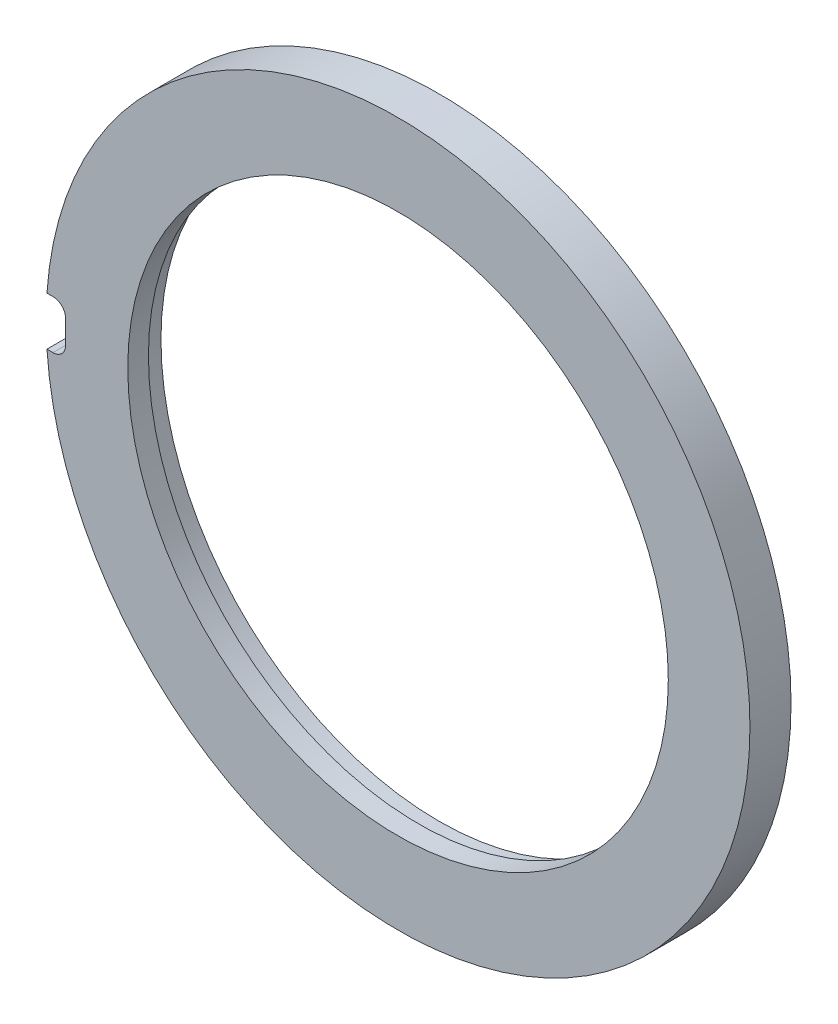
ISO-10303-21;
HEADER;
FILE_DESCRIPTION(('STEP AP214'),'2;1');
FILE_NAME('part.step','',(''),(''),'','','');
FILE_SCHEMA(('AUTOMOTIVE_DESIGN { 1 0 10303 214 1 1 1 1 }'));
ENDSEC;
DATA;
#1=APPLICATION_CONTEXT('core data for automotive mechanical design processes');
#2=APPLICATION_PROTOCOL_DEFINITION('international standard','automotive_design',2000,#1);
#3=PRODUCT_CONTEXT('',#1,'mechanical');
#4=PRODUCT('Part','Part','',(#3));
#5=PRODUCT_RELATED_PRODUCT_CATEGORY('part','',(#4));
#6=PRODUCT_DEFINITION_FORMATION('','',#4);
#7=PRODUCT_DEFINITION_CONTEXT('part definition',#1,'design');
#8=PRODUCT_DEFINITION('design','',#6,#7);
#9=PRODUCT_DEFINITION_SHAPE('','',#8);
#10=(LENGTH_UNIT() NAMED_UNIT(*) SI_UNIT(.MILLI.,.METRE.));
#11=(NAMED_UNIT(*) PLANE_ANGLE_UNIT() SI_UNIT($,.RADIAN.));
#12=(NAMED_UNIT(*) SI_UNIT($,.STERADIAN.) SOLID_ANGLE_UNIT());
#13=UNCERTAINTY_MEASURE_WITH_UNIT(LENGTH_MEASURE(1.E-05),#10,'distance_accuracy_value','');
#14=(GEOMETRIC_REPRESENTATION_CONTEXT(3) GLOBAL_UNCERTAINTY_ASSIGNED_CONTEXT((#13)) GLOBAL_UNIT_ASSIGNED_CONTEXT((#10,
#11,#12)) REPRESENTATION_CONTEXT('',''));
#15=CARTESIAN_POINT('',(0.,0.,0.));
#16=DIRECTION('',(0.,0.,1.));
#17=DIRECTION('',(1.,0.,0.));
#18=AXIS2_PLACEMENT_3D('',#15,#16,#17);
#19=CARTESIAN_POINT('',(0.,0.,0.));
#20=DIRECTION('',(0.,0.,1.));
#21=DIRECTION('',(1.,0.,0.));
#22=AXIS2_PLACEMENT_3D('',#19,#20,#21);
#23=CYLINDRICAL_SURFACE('',#22,16.7);
#24=CARTESIAN_POINT('',(0.,0.,0.));
#25=DIRECTION('',(0.,0.,1.));
#26=DIRECTION('',(1.,0.,0.));
#27=AXIS2_PLACEMENT_3D('',#24,#25,#26);
#28=CIRCLE('',#27,16.7);
#29=CARTESIAN_POINT('',(-16.6603571390292,-1.14999999999994,0.));
#30=VERTEX_POINT('',#29);
#31=CARTESIAN_POINT('',(-16.6603571390292,1.15000000000006,0.));
#32=VERTEX_POINT('',#31);
#33=EDGE_CURVE('E183',#30,#32,#28,.T.);
#34=ORIENTED_EDGE('',*,*,#33,.F.);
#35=DIRECTION('',(0.,0.,-1.));
#36=VECTOR('',#35,1.);
#37=CARTESIAN_POINT('',(-16.6603571390292,-1.14999999999994,1.05));
#38=LINE('',#37,#36);
#39=CARTESIAN_POINT('',(-16.6603571390292,-1.14999999999994,-1.95));
#40=VERTEX_POINT('',#39);
#41=EDGE_CURVE('E117',#30,#40,#38,.T.);
#42=ORIENTED_EDGE('',*,*,#41,.T.);
#43=CARTESIAN_POINT('',(0.,0.,-1.95));
#44=DIRECTION('',(0.,0.,1.));
#45=DIRECTION('',(1.,0.,0.));
#46=AXIS2_PLACEMENT_3D('',#43,#44,#45);
#47=CIRCLE('',#46,16.7);
#48=CARTESIAN_POINT('',(-16.6603571390292,1.15000000000006,-1.95));
#49=VERTEX_POINT('',#48);
#50=EDGE_CURVE('E125',#40,#49,#47,.T.);
#51=ORIENTED_EDGE('',*,*,#50,.T.);
#52=DIRECTION('',(0.,0.,-1.));
#53=VECTOR('',#52,1.);
#54=CARTESIAN_POINT('',(-16.6603571390292,1.15000000000006,1.05));
#55=LINE('',#54,#53);
#56=EDGE_CURVE('E108',#32,#49,#55,.T.);
#57=ORIENTED_EDGE('',*,*,#56,.F.);
#58=EDGE_LOOP('',(#34,#42,#51,#57));
#59=FACE_BOUND('',#58,.T.);
#60=ADVANCED_FACE('F56',(#59),#23,.T.);
#61=CARTESIAN_POINT('',(-16.7,0.,-1.95));
#62=DIRECTION('',(0.,0.,1.));
#63=DIRECTION('',(1.,0.,0.));
#64=AXIS2_PLACEMENT_3D('',#61,#62,#63);
#65=PLANE('',#64);
#66=ORIENTED_EDGE('',*,*,#50,.F.);
#67=DIRECTION('',(-1.,0.,0.));
#68=VECTOR('',#67,1.);
#69=CARTESIAN_POINT('',(-16.6603571390292,-1.14999999999994,-1.95));
#70=LINE('',#69,#68);
#71=CARTESIAN_POINT('',(-16.3736228252639,-1.14999999999994,-1.95));
#72=VERTEX_POINT('',#71);
#73=EDGE_CURVE('E118',#72,#40,#70,.T.);
#74=ORIENTED_EDGE('',*,*,#73,.F.);
#75=CARTESIAN_POINT('',(-16.3736228252639,-0.549999999999941,-1.95));
#76=DIRECTION('',(0.,0.,1.));
#77=DIRECTION('',(1.,0.,0.));
#78=AXIS2_PLACEMENT_3D('',#75,#76,#77);
#79=CIRCLE('',#78,0.6);
#80=CARTESIAN_POINT('',(-15.7736228252639,-0.549999999999942,-1.95));
#81=VERTEX_POINT('',#80);
#82=EDGE_CURVE('E211',#72,#81,#79,.T.);
#83=ORIENTED_EDGE('',*,*,#82,.T.);
#84=DIRECTION('',(0.,-1.,0.));
#85=VECTOR('',#84,1.);
#86=CARTESIAN_POINT('',(-15.7736228252639,1.15000000000006,-1.95));
#87=LINE('',#86,#85);
#88=CARTESIAN_POINT('',(-15.7736228252639,0.550000000000057,-1.95));
#89=VERTEX_POINT('',#88);
#90=EDGE_CURVE('E127',#89,#81,#87,.T.);
#91=ORIENTED_EDGE('',*,*,#90,.F.);
#92=CARTESIAN_POINT('',(-16.3736228252639,0.550000000000059,-1.95));
#93=DIRECTION('',(0.,0.,1.));
#94=DIRECTION('',(1.,0.,0.));
#95=AXIS2_PLACEMENT_3D('',#92,#93,#94);
#96=CIRCLE('',#95,0.6);
#97=CARTESIAN_POINT('',(-16.3736228252639,1.15000000000006,-1.95));
#98=VERTEX_POINT('',#97);
#99=EDGE_CURVE('E66',#89,#98,#96,.T.);
#100=ORIENTED_EDGE('',*,*,#99,.T.);
#101=DIRECTION('',(1.,0.,0.));
#102=VECTOR('',#101,1.);
#103=CARTESIAN_POINT('',(-16.6603571390292,1.15000000000006,-1.95));
#104=LINE('',#103,#102);
#105=EDGE_CURVE('E110',#49,#98,#104,.T.);
#106=ORIENTED_EDGE('',*,*,#105,.F.);
#107=EDGE_LOOP('',(#66,#74,#83,#91,#100,#106));
#108=FACE_BOUND('',#107,.T.);
#109=CARTESIAN_POINT('',(0.,0.,-1.95));
#110=DIRECTION('',(0.,0.,1.));
#111=DIRECTION('',(1.,0.,0.));
#112=AXIS2_PLACEMENT_3D('',#109,#110,#111);
#113=CIRCLE('',#112,13.2);
#114=CARTESIAN_POINT('',(13.2,0.,-1.95));
#115=VERTEX_POINT('',#114);
#116=EDGE_CURVE('E132',#115,#115,#113,.T.);
#117=ORIENTED_EDGE('',*,*,#116,.T.);
#118=EDGE_LOOP('',(#117));
#119=FACE_BOUND('',#118,.T.);
#120=ADVANCED_FACE('F122',(#108,#119),#65,.F.);
#121=CARTESIAN_POINT('',(0.,0.,0.));
#122=DIRECTION('',(0.,0.,1.));
#123=DIRECTION('',(1.,0.,0.));
#124=AXIS2_PLACEMENT_3D('',#121,#122,#123);
#125=CYLINDRICAL_SURFACE('',#124,13.2);
#126=ORIENTED_EDGE('',*,*,#116,.F.);
#127=EDGE_LOOP('',(#126));
#128=FACE_BOUND('',#127,.T.);
#129=CARTESIAN_POINT('',(0.,0.,-0.98));
#130=DIRECTION('',(0.,0.,1.));
#131=DIRECTION('',(1.,0.,0.));
#132=AXIS2_PLACEMENT_3D('',#129,#130,#131);
#133=CIRCLE('',#132,13.2);
#134=CARTESIAN_POINT('',(13.2,0.,-0.98));
#135=VERTEX_POINT('',#134);
#136=EDGE_CURVE('E141',#135,#135,#133,.T.);
#137=ORIENTED_EDGE('',*,*,#136,.T.);
#138=EDGE_LOOP('',(#137));
#139=FACE_BOUND('',#138,.T.);
#140=ADVANCED_FACE('F164',(#128,#139),#125,.F.);
#141=CARTESIAN_POINT('',(-13.2,0.,-0.98));
#142=DIRECTION('',(0.,0.,1.));
#143=DIRECTION('',(1.,0.,0.));
#144=AXIS2_PLACEMENT_3D('',#141,#142,#143);
#145=PLANE('',#144);
#146=ORIENTED_EDGE('',*,*,#136,.F.);
#147=EDGE_LOOP('',(#146));
#148=FACE_BOUND('',#147,.T.);
#149=CARTESIAN_POINT('',(0.,0.,-0.98));
#150=DIRECTION('',(0.,0.,1.));
#151=DIRECTION('',(1.,0.,0.));
#152=AXIS2_PLACEMENT_3D('',#149,#150,#151);
#153=CIRCLE('',#152,12.825);
#154=CARTESIAN_POINT('',(12.825,0.,-0.98));
#155=VERTEX_POINT('',#154);
#156=EDGE_CURVE('E152',#155,#155,#153,.T.);
#157=ORIENTED_EDGE('',*,*,#156,.T.);
#158=EDGE_LOOP('',(#157));
#159=FACE_BOUND('',#158,.T.);
#160=ADVANCED_FACE('F167',(#148,#159),#145,.F.);
#161=CARTESIAN_POINT('',(0.,0.,0.));
#162=DIRECTION('',(0.,0.,1.));
#163=DIRECTION('',(1.,0.,0.));
#164=AXIS2_PLACEMENT_3D('',#161,#162,#163);
#165=CYLINDRICAL_SURFACE('',#164,12.825);
#166=ORIENTED_EDGE('',*,*,#156,.F.);
#167=EDGE_LOOP('',(#166));
#168=FACE_BOUND('',#167,.T.);
#169=CARTESIAN_POINT('',(0.,0.,0.));
#170=DIRECTION('',(0.,0.,1.));
#171=DIRECTION('',(1.,0.,0.));
#172=AXIS2_PLACEMENT_3D('',#169,#170,#171);
#173=CIRCLE('',#172,12.825);
#174=CARTESIAN_POINT('',(12.825,0.,0.));
#175=VERTEX_POINT('',#174);
#176=EDGE_CURVE('E156',#175,#175,#173,.T.);
#177=ORIENTED_EDGE('',*,*,#176,.T.);
#178=EDGE_LOOP('',(#177));
#179=FACE_BOUND('',#178,.T.);
#180=ADVANCED_FACE('F171',(#168,#179),#165,.F.);
#181=CARTESIAN_POINT('',(-16.7,0.,0.));
#182=DIRECTION('',(0.,0.,-1.));
#183=DIRECTION('',(-1.,0.,0.));
#184=AXIS2_PLACEMENT_3D('',#181,#182,#183);
#185=PLANE('',#184);
#186=ORIENTED_EDGE('',*,*,#176,.F.);
#187=EDGE_LOOP('',(#186));
#188=FACE_BOUND('',#187,.T.);
#189=DIRECTION('',(1.,0.,0.));
#190=VECTOR('',#189,1.);
#191=CARTESIAN_POINT('',(-16.7,1.15000000000006,0.));
#192=LINE('',#191,#190);
#193=CARTESIAN_POINT('',(-16.3736228252639,1.15000000000006,0.));
#194=VERTEX_POINT('',#193);
#195=EDGE_CURVE('E111',#32,#194,#192,.T.);
#196=ORIENTED_EDGE('',*,*,#195,.T.);
#197=CARTESIAN_POINT('',(-16.3736228252639,0.550000000000059,0.));
#198=DIRECTION('',(0.,0.,-1.));
#199=DIRECTION('',(-1.,0.,0.));
#200=AXIS2_PLACEMENT_3D('',#197,#198,#199);
#201=CIRCLE('',#200,0.6);
#202=CARTESIAN_POINT('',(-15.7736228252639,0.550000000000057,0.));
#203=VERTEX_POINT('',#202);
#204=EDGE_CURVE('E12',#194,#203,#201,.T.);
#205=ORIENTED_EDGE('',*,*,#204,.T.);
#206=DIRECTION('',(0.,-1.,0.));
#207=VECTOR('',#206,1.);
#208=CARTESIAN_POINT('',(-15.7736228252639,0.,0.));
#209=LINE('',#208,#207);
#210=CARTESIAN_POINT('',(-15.7736228252639,-0.549999999999943,0.));
#211=VERTEX_POINT('',#210);
#212=EDGE_CURVE('E137',#203,#211,#209,.T.);
#213=ORIENTED_EDGE('',*,*,#212,.T.);
#214=CARTESIAN_POINT('',(-16.3736228252639,-0.549999999999941,0.));
#215=DIRECTION('',(0.,0.,-1.));
#216=DIRECTION('',(-1.,0.,0.));
#217=AXIS2_PLACEMENT_3D('',#214,#215,#216);
#218=CIRCLE('',#217,0.6);
#219=CARTESIAN_POINT('',(-16.3736228252639,-1.14999999999994,0.));
#220=VERTEX_POINT('',#219);
#221=EDGE_CURVE('E216',#211,#220,#218,.T.);
#222=ORIENTED_EDGE('',*,*,#221,.T.);
#223=DIRECTION('',(-1.,0.,0.));
#224=VECTOR('',#223,1.);
#225=CARTESIAN_POINT('',(-16.7,-1.14999999999994,0.));
#226=LINE('',#225,#224);
#227=EDGE_CURVE('E225',#220,#30,#226,.T.);
#228=ORIENTED_EDGE('',*,*,#227,.T.);
#229=ORIENTED_EDGE('',*,*,#33,.T.);
#230=EDGE_LOOP('',(#196,#205,#213,#222,#228,#229));
#231=FACE_BOUND('',#230,.T.);
#232=ADVANCED_FACE('F177',(#188,#231),#185,.F.);
#233=CARTESIAN_POINT('',(-16.6603571390292,-1.14999999999994,1.05));
#234=DIRECTION('',(0.,-1.,0.));
#235=DIRECTION('',(1.,0.,0.));
#236=AXIS2_PLACEMENT_3D('',#233,#234,#235);
#237=PLANE('',#236);
#238=ORIENTED_EDGE('',*,*,#227,.F.);
#239=DIRECTION('',(0.,0.,-1.));
#240=VECTOR('',#239,1.);
#241=CARTESIAN_POINT('',(-16.3736228252639,-1.14999999999994,-1.95));
#242=LINE('',#241,#240);
#243=EDGE_CURVE('E228',#220,#72,#242,.T.);
#244=ORIENTED_EDGE('',*,*,#243,.T.);
#245=ORIENTED_EDGE('',*,*,#73,.T.);
#246=ORIENTED_EDGE('',*,*,#41,.F.);
#247=EDGE_LOOP('',(#238,#244,#245,#246));
#248=FACE_BOUND('',#247,.T.);
#249=ADVANCED_FACE('F294',(#248),#237,.F.);
#250=CARTESIAN_POINT('',(-15.7736228252639,1.15000000000006,1.05));
#251=DIRECTION('',(1.,0.,0.));
#252=DIRECTION('',(0.,1.,0.));
#253=AXIS2_PLACEMENT_3D('',#250,#251,#252);
#254=PLANE('',#253);
#255=ORIENTED_EDGE('',*,*,#90,.T.);
#256=DIRECTION('',(0.,0.,-1.));
#257=VECTOR('',#256,1.);
#258=CARTESIAN_POINT('',(-15.7736228252639,-0.549999999999943,0.));
#259=LINE('',#258,#257);
#260=EDGE_CURVE('E236',#81,#211,#259,.F.);
#261=ORIENTED_EDGE('',*,*,#260,.T.);
#262=ORIENTED_EDGE('',*,*,#212,.F.);
#263=DIRECTION('',(0.,0.,-1.));
#264=VECTOR('',#263,1.);
#265=CARTESIAN_POINT('',(-15.7736228252639,0.550000000000057,-1.95));
#266=LINE('',#265,#264);
#267=EDGE_CURVE('E232',#203,#89,#266,.T.);
#268=ORIENTED_EDGE('',*,*,#267,.T.);
#269=EDGE_LOOP('',(#255,#261,#262,#268));
#270=FACE_BOUND('',#269,.T.);
#271=ADVANCED_FACE('F260',(#270),#254,.F.);
#272=CARTESIAN_POINT('',(-16.6603571390292,1.15000000000006,1.05));
#273=DIRECTION('',(0.,1.,0.));
#274=DIRECTION('',(-1.,0.,0.));
#275=AXIS2_PLACEMENT_3D('',#272,#273,#274);
#276=PLANE('',#275);
#277=ORIENTED_EDGE('',*,*,#105,.T.);
#278=DIRECTION('',(0.,0.,-1.));
#279=VECTOR('',#278,1.);
#280=CARTESIAN_POINT('',(-16.3736228252639,1.15000000000006,0.));
#281=LINE('',#280,#279);
#282=EDGE_CURVE('E73',#98,#194,#281,.F.);
#283=ORIENTED_EDGE('',*,*,#282,.T.);
#284=ORIENTED_EDGE('',*,*,#195,.F.);
#285=ORIENTED_EDGE('',*,*,#56,.T.);
#286=EDGE_LOOP('',(#277,#283,#284,#285));
#287=FACE_BOUND('',#286,.T.);
#288=ADVANCED_FACE('F109',(#287),#276,.F.);
#289=CARTESIAN_POINT('',(-16.3736228252639,-0.549999999999941,1.05));
#290=DIRECTION('',(0.,0.,1.));
#291=DIRECTION('',(1.,0.,0.));
#292=AXIS2_PLACEMENT_3D('',#289,#290,#291);
#293=CYLINDRICAL_SURFACE('',#292,0.6);
#294=ORIENTED_EDGE('',*,*,#221,.F.);
#295=ORIENTED_EDGE('',*,*,#260,.F.);
#296=ORIENTED_EDGE('',*,*,#82,.F.);
#297=ORIENTED_EDGE('',*,*,#243,.F.);
#298=EDGE_LOOP('',(#294,#295,#296,#297));
#299=FACE_BOUND('',#298,.T.);
#300=ADVANCED_FACE('F259',(#299),#293,.F.);
#301=CARTESIAN_POINT('',(-16.3736228252639,0.550000000000059,1.05));
#302=DIRECTION('',(0.,0.,1.));
#303=DIRECTION('',(1.,0.,0.));
#304=AXIS2_PLACEMENT_3D('',#301,#302,#303);
#305=CYLINDRICAL_SURFACE('',#304,0.6);
#306=ORIENTED_EDGE('',*,*,#204,.F.);
#307=ORIENTED_EDGE('',*,*,#282,.F.);
#308=ORIENTED_EDGE('',*,*,#99,.F.);
#309=ORIENTED_EDGE('',*,*,#267,.F.);
#310=EDGE_LOOP('',(#306,#307,#308,#309));
#311=FACE_BOUND('',#310,.T.);
#312=ADVANCED_FACE('F58',(#311),#305,.F.);
#313=CLOSED_SHELL('',(#60,#120,#140,#160,#180,#232,#249,#271,#288,#300,#312));
#314=MANIFOLD_SOLID_BREP('B2',#313);
#315=ADVANCED_BREP_SHAPE_REPRESENTATION('',(#18,#314),#14);
#316=SHAPE_DEFINITION_REPRESENTATION(#9,#315);
ENDSEC;
END-ISO-10303-21;
